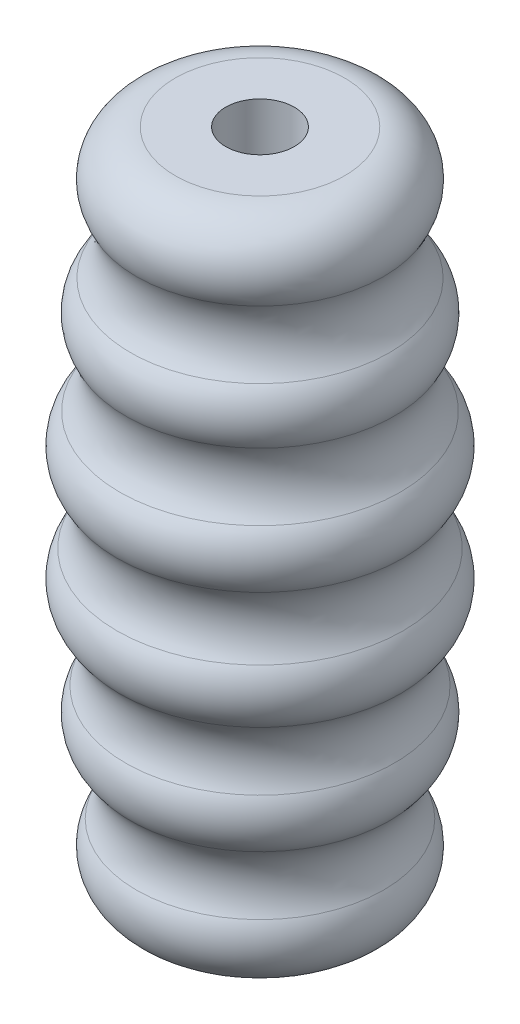
ISO-10303-21;
HEADER;
FILE_DESCRIPTION(('STEP AP214'),'2;1');
FILE_NAME('part.step','',(''),(''),'','','');
FILE_SCHEMA(('AUTOMOTIVE_DESIGN { 1 0 10303 214 1 1 1 1 }'));
ENDSEC;
DATA;
#1=APPLICATION_CONTEXT('core data for automotive mechanical design processes');
#2=APPLICATION_PROTOCOL_DEFINITION('international standard','automotive_design',2000,#1);
#3=PRODUCT_CONTEXT('',#1,'mechanical');
#4=PRODUCT('Part','Part','',(#3));
#5=PRODUCT_RELATED_PRODUCT_CATEGORY('part','',(#4));
#6=PRODUCT_DEFINITION_FORMATION('','',#4);
#7=PRODUCT_DEFINITION_CONTEXT('part definition',#1,'design');
#8=PRODUCT_DEFINITION('design','',#6,#7);
#9=PRODUCT_DEFINITION_SHAPE('','',#8);
#10=(LENGTH_UNIT() NAMED_UNIT(*) SI_UNIT(.MILLI.,.METRE.));
#11=(NAMED_UNIT(*) PLANE_ANGLE_UNIT() SI_UNIT($,.RADIAN.));
#12=(NAMED_UNIT(*) SI_UNIT($,.STERADIAN.) SOLID_ANGLE_UNIT());
#13=UNCERTAINTY_MEASURE_WITH_UNIT(LENGTH_MEASURE(1.E-05),#10,'distance_accuracy_value','');
#14=(GEOMETRIC_REPRESENTATION_CONTEXT(3) GLOBAL_UNCERTAINTY_ASSIGNED_CONTEXT((#13)) GLOBAL_UNIT_ASSIGNED_CONTEXT((#10,
#11,#12)) REPRESENTATION_CONTEXT('',''));
#15=CARTESIAN_POINT('',(0.,0.,0.));
#16=DIRECTION('',(0.,0.,1.));
#17=DIRECTION('',(1.,0.,0.));
#18=AXIS2_PLACEMENT_3D('',#15,#16,#17);
#19=CARTESIAN_POINT('',(0.,6.81659663819396,0.));
#20=DIRECTION('',(0.,1.,0.));
#21=DIRECTION('',(-1.,0.,0.));
#22=AXIS2_PLACEMENT_3D('',#19,#20,#21);
#23=TOROIDAL_SURFACE('',#22,10.0436974740688,3.);
#24=CARTESIAN_POINT('',(0.,4.84390756281543,0.));
#25=DIRECTION('',(0.,1.,0.));
#26=DIRECTION('',(-1.,0.,0.));
#27=AXIS2_PLACEMENT_3D('',#24,#25,#26);
#28=CIRCLE('',#27,7.78349885184945);
#29=CARTESIAN_POINT('',(-7.78349885184946,4.84390756281543,0.));
#30=VERTEX_POINT('',#29);
#31=EDGE_CURVE('E10',#30,#30,#28,.T.);
#32=ORIENTED_EDGE('',*,*,#31,.T.);
#33=EDGE_LOOP('',(#32));
#34=FACE_BOUND('',#33,.T.);
#35=CARTESIAN_POINT('',(0.,8.33481665372453,0.));
#36=DIRECTION('',(0.,1.,0.));
#37=DIRECTION('',(-1.,0.,0.));
#38=AXIS2_PLACEMENT_3D('',#35,#36,#37);
#39=CIRCLE('',#38,7.45622612457672);
#40=CARTESIAN_POINT('',(-7.45622612457673,8.33481665372453,0.));
#41=VERTEX_POINT('',#40);
#42=EDGE_CURVE('E78',#41,#41,#39,.T.);
#43=ORIENTED_EDGE('',*,*,#42,.F.);
#44=EDGE_LOOP('',(#43));
#45=FACE_BOUND('',#44,.T.);
#46=ADVANCED_FACE('F32',(#34,#45),#23,.F.);
#47=CARTESIAN_POINT('',(0.,3.2,0.));
#48=DIRECTION('',(0.,1.,0.));
#49=DIRECTION('',(-1.,0.,0.));
#50=AXIS2_PLACEMENT_3D('',#47,#48,#49);
#51=TOROIDAL_SURFACE('',#50,5.89999999999999,2.5);
#52=CARTESIAN_POINT('',(0.,1.74545454545455,0.));
#53=DIRECTION('',(0.,1.,0.));
#54=DIRECTION('',(-1.,0.,0.));
#55=AXIS2_PLACEMENT_3D('',#52,#53,#54);
#56=CIRCLE('',#55,7.93329720421318);
#57=CARTESIAN_POINT('',(-7.93329720421318,1.74545454545455,0.));
#58=VERTEX_POINT('',#57);
#59=EDGE_CURVE('E38',#58,#58,#56,.T.);
#60=ORIENTED_EDGE('',*,*,#59,.T.);
#61=EDGE_LOOP('',(#60));
#62=FACE_BOUND('',#61,.T.);
#63=ORIENTED_EDGE('',*,*,#31,.F.);
#64=EDGE_LOOP('',(#63));
#65=FACE_BOUND('',#64,.T.);
#66=ADVANCED_FACE('F86',(#62,#65),#51,.T.);
#67=CARTESIAN_POINT('',(0.,0.,0.));
#68=DIRECTION('',(0.,1.,0.));
#69=DIRECTION('',(-1.,0.,0.));
#70=AXIS2_PLACEMENT_3D('',#67,#68,#69);
#71=TOROIDAL_SURFACE('',#70,10.373253849269,3.);
#72=CARTESIAN_POINT('',(0.,-1.74545454545455,0.));
#73=DIRECTION('',(0.,1.,0.));
#74=DIRECTION('',(-1.,0.,0.));
#75=AXIS2_PLACEMENT_3D('',#72,#73,#74);
#76=CIRCLE('',#75,7.93329720421318);
#77=CARTESIAN_POINT('',(-7.93329720421318,-1.74545454545455,0.));
#78=VERTEX_POINT('',#77);
#79=EDGE_CURVE('E42',#78,#78,#76,.T.);
#80=ORIENTED_EDGE('',*,*,#79,.T.);
#81=EDGE_LOOP('',(#80));
#82=FACE_BOUND('',#81,.T.);
#83=ORIENTED_EDGE('',*,*,#59,.F.);
#84=EDGE_LOOP('',(#83));
#85=FACE_BOUND('',#84,.T.);
#86=ADVANCED_FACE('F90',(#82,#85),#71,.F.);
#87=CARTESIAN_POINT('',(0.,-3.2,0.));
#88=DIRECTION('',(0.,1.,0.));
#89=DIRECTION('',(-1.,0.,0.));
#90=AXIS2_PLACEMENT_3D('',#87,#88,#89);
#91=TOROIDAL_SURFACE('',#90,5.9,2.5);
#92=CARTESIAN_POINT('',(0.,-4.84390756281543,0.));
#93=DIRECTION('',(0.,1.,0.));
#94=DIRECTION('',(-1.,0.,0.));
#95=AXIS2_PLACEMENT_3D('',#92,#93,#94);
#96=CIRCLE('',#95,7.78349885184945);
#97=CARTESIAN_POINT('',(-7.78349885184946,-4.84390756281544,0.));
#98=VERTEX_POINT('',#97);
#99=EDGE_CURVE('E46',#98,#98,#96,.T.);
#100=ORIENTED_EDGE('',*,*,#99,.T.);
#101=EDGE_LOOP('',(#100));
#102=FACE_BOUND('',#101,.T.);
#103=ORIENTED_EDGE('',*,*,#79,.F.);
#104=EDGE_LOOP('',(#103));
#105=FACE_BOUND('',#104,.T.);
#106=ADVANCED_FACE('F94',(#102,#105),#91,.T.);
#107=CARTESIAN_POINT('',(0.,-6.81659663819395,0.));
#108=DIRECTION('',(0.,1.,0.));
#109=DIRECTION('',(-1.,0.,0.));
#110=AXIS2_PLACEMENT_3D('',#107,#108,#109);
#111=TOROIDAL_SURFACE('',#110,10.0436974740688,3.);
#112=CARTESIAN_POINT('',(0.,-8.33481665372452,0.));
#113=DIRECTION('',(0.,1.,0.));
#114=DIRECTION('',(-1.,0.,0.));
#115=AXIS2_PLACEMENT_3D('',#112,#113,#114);
#116=CIRCLE('',#115,7.45622612457673);
#117=CARTESIAN_POINT('',(-7.45622612457673,-8.33481665372452,0.));
#118=VERTEX_POINT('',#117);
#119=EDGE_CURVE('E51',#118,#118,#116,.T.);
#120=ORIENTED_EDGE('',*,*,#119,.T.);
#121=EDGE_LOOP('',(#120));
#122=FACE_BOUND('',#121,.T.);
#123=ORIENTED_EDGE('',*,*,#99,.F.);
#124=EDGE_LOOP('',(#123));
#125=FACE_BOUND('',#124,.T.);
#126=ADVANCED_FACE('F101',(#122,#125),#111,.F.);
#127=CARTESIAN_POINT('',(0.,-9.6,0.));
#128=DIRECTION('',(0.,1.,0.));
#129=DIRECTION('',(-1.,0.,0.));
#130=AXIS2_PLACEMENT_3D('',#127,#128,#129);
#131=TOROIDAL_SURFACE('',#130,5.29999999999999,2.5);
#132=CARTESIAN_POINT('',(0.,-11.2439075628154,0.));
#133=DIRECTION('',(0.,1.,0.));
#134=DIRECTION('',(-1.,0.,0.));
#135=AXIS2_PLACEMENT_3D('',#132,#133,#134);
#136=CIRCLE('',#135,7.18349885184945);
#137=CARTESIAN_POINT('',(-7.18349885184945,-11.2439075628154,0.));
#138=VERTEX_POINT('',#137);
#139=EDGE_CURVE('E54',#138,#138,#136,.T.);
#140=ORIENTED_EDGE('',*,*,#139,.T.);
#141=EDGE_LOOP('',(#140));
#142=FACE_BOUND('',#141,.T.);
#143=ORIENTED_EDGE('',*,*,#119,.F.);
#144=EDGE_LOOP('',(#143));
#145=FACE_BOUND('',#144,.T.);
#146=ADVANCED_FACE('F105',(#142,#145),#131,.T.);
#147=CARTESIAN_POINT('',(0.,-13.216596638194,0.));
#148=DIRECTION('',(0.,1.,0.));
#149=DIRECTION('',(-1.,0.,0.));
#150=AXIS2_PLACEMENT_3D('',#147,#148,#149);
#151=TOROIDAL_SURFACE('',#150,9.4436974740688,3.);
#152=CARTESIAN_POINT('',(0.,-14.7348166537245,0.));
#153=DIRECTION('',(0.,1.,0.));
#154=DIRECTION('',(-1.,0.,0.));
#155=AXIS2_PLACEMENT_3D('',#152,#153,#154);
#156=CIRCLE('',#155,6.85622612457672);
#157=CARTESIAN_POINT('',(-6.85622612457673,-14.7348166537245,0.));
#158=VERTEX_POINT('',#157);
#159=EDGE_CURVE('E57',#158,#158,#156,.T.);
#160=ORIENTED_EDGE('',*,*,#159,.T.);
#161=EDGE_LOOP('',(#160));
#162=FACE_BOUND('',#161,.T.);
#163=ORIENTED_EDGE('',*,*,#139,.F.);
#164=EDGE_LOOP('',(#163));
#165=FACE_BOUND('',#164,.T.);
#166=ADVANCED_FACE('F109',(#162,#165),#151,.F.);
#167=CARTESIAN_POINT('',(0.,-16.,0.));
#168=DIRECTION('',(0.,1.,0.));
#169=DIRECTION('',(-1.,0.,0.));
#170=AXIS2_PLACEMENT_3D('',#167,#168,#169);
#171=TOROIDAL_SURFACE('',#170,4.69999999999999,2.5);
#172=CARTESIAN_POINT('',(0.,-18.5,0.));
#173=DIRECTION('',(0.,1.,0.));
#174=DIRECTION('',(-1.,0.,0.));
#175=AXIS2_PLACEMENT_3D('',#172,#173,#174);
#176=CIRCLE('',#175,4.69999999999999);
#177=CARTESIAN_POINT('',(-4.7,-18.5,0.));
#178=VERTEX_POINT('',#177);
#179=EDGE_CURVE('E60',#178,#178,#176,.T.);
#180=ORIENTED_EDGE('',*,*,#179,.T.);
#181=EDGE_LOOP('',(#180));
#182=FACE_BOUND('',#181,.T.);
#183=ORIENTED_EDGE('',*,*,#159,.F.);
#184=EDGE_LOOP('',(#183));
#185=FACE_BOUND('',#184,.T.);
#186=ADVANCED_FACE('F113',(#182,#185),#171,.T.);
#187=CARTESIAN_POINT('',(-4.7,-18.5,0.));
#188=DIRECTION('',(0.,-1.,0.));
#189=DIRECTION('',(1.,0.,0.));
#190=AXIS2_PLACEMENT_3D('',#187,#188,#189);
#191=PLANE('',#190);
#192=CARTESIAN_POINT('',(0.,-18.5,0.));
#193=DIRECTION('',(0.,1.,0.));
#194=DIRECTION('',(-1.,0.,0.));
#195=AXIS2_PLACEMENT_3D('',#192,#193,#194);
#196=CIRCLE('',#195,1.9);
#197=CARTESIAN_POINT('',(-1.9,-18.5,0.));
#198=VERTEX_POINT('',#197);
#199=EDGE_CURVE('E63',#198,#198,#196,.T.);
#200=ORIENTED_EDGE('',*,*,#199,.T.);
#201=EDGE_LOOP('',(#200));
#202=FACE_BOUND('',#201,.T.);
#203=ORIENTED_EDGE('',*,*,#179,.F.);
#204=EDGE_LOOP('',(#203));
#205=FACE_BOUND('',#204,.T.);
#206=ADVANCED_FACE('F117',(#202,#205),#191,.T.);
#207=CARTESIAN_POINT('',(0.,25.8856814862195,0.));
#208=DIRECTION('',(0.,1.,0.));
#209=DIRECTION('',(-1.,0.,0.));
#210=AXIS2_PLACEMENT_3D('',#207,#208,#209);
#211=CYLINDRICAL_SURFACE('',#210,1.89999999999999);
#212=CARTESIAN_POINT('',(0.,18.5,0.));
#213=DIRECTION('',(0.,1.,0.));
#214=DIRECTION('',(-1.,0.,0.));
#215=AXIS2_PLACEMENT_3D('',#212,#213,#214);
#216=CIRCLE('',#215,1.89999999999999);
#217=CARTESIAN_POINT('',(-1.9,18.5,0.));
#218=VERTEX_POINT('',#217);
#219=EDGE_CURVE('E66',#218,#218,#216,.T.);
#220=ORIENTED_EDGE('',*,*,#219,.T.);
#221=EDGE_LOOP('',(#220));
#222=FACE_BOUND('',#221,.T.);
#223=ORIENTED_EDGE('',*,*,#199,.F.);
#224=EDGE_LOOP('',(#223));
#225=FACE_BOUND('',#224,.T.);
#226=ADVANCED_FACE('F121',(#222,#225),#211,.F.);
#227=CARTESIAN_POINT('',(-4.7,18.5,0.));
#228=DIRECTION('',(0.,1.,0.));
#229=DIRECTION('',(-1.,0.,0.));
#230=AXIS2_PLACEMENT_3D('',#227,#228,#229);
#231=PLANE('',#230);
#232=CARTESIAN_POINT('',(0.,18.5,0.));
#233=DIRECTION('',(0.,1.,0.));
#234=DIRECTION('',(-1.,0.,0.));
#235=AXIS2_PLACEMENT_3D('',#232,#233,#234);
#236=CIRCLE('',#235,4.69999999999999);
#237=CARTESIAN_POINT('',(-4.7,18.5,0.));
#238=VERTEX_POINT('',#237);
#239=EDGE_CURVE('E69',#238,#238,#236,.T.);
#240=ORIENTED_EDGE('',*,*,#239,.T.);
#241=EDGE_LOOP('',(#240));
#242=FACE_BOUND('',#241,.T.);
#243=ORIENTED_EDGE('',*,*,#219,.F.);
#244=EDGE_LOOP('',(#243));
#245=FACE_BOUND('',#244,.T.);
#246=ADVANCED_FACE('F125',(#242,#245),#231,.T.);
#247=CARTESIAN_POINT('',(0.,16.,0.));
#248=DIRECTION('',(0.,1.,0.));
#249=DIRECTION('',(-1.,0.,0.));
#250=AXIS2_PLACEMENT_3D('',#247,#248,#249);
#251=TOROIDAL_SURFACE('',#250,4.69999999999999,2.5);
#252=CARTESIAN_POINT('',(0.,14.7348166537245,0.));
#253=DIRECTION('',(0.,1.,0.));
#254=DIRECTION('',(-1.,0.,0.));
#255=AXIS2_PLACEMENT_3D('',#252,#253,#254);
#256=CIRCLE('',#255,6.85622612457672);
#257=CARTESIAN_POINT('',(-6.85622612457673,14.7348166537245,0.));
#258=VERTEX_POINT('',#257);
#259=EDGE_CURVE('E72',#258,#258,#256,.T.);
#260=ORIENTED_EDGE('',*,*,#259,.T.);
#261=EDGE_LOOP('',(#260));
#262=FACE_BOUND('',#261,.T.);
#263=ORIENTED_EDGE('',*,*,#239,.F.);
#264=EDGE_LOOP('',(#263));
#265=FACE_BOUND('',#264,.T.);
#266=ADVANCED_FACE('F129',(#262,#265),#251,.T.);
#267=CARTESIAN_POINT('',(0.,13.216596638194,0.));
#268=DIRECTION('',(0.,1.,0.));
#269=DIRECTION('',(-1.,0.,0.));
#270=AXIS2_PLACEMENT_3D('',#267,#268,#269);
#271=TOROIDAL_SURFACE('',#270,9.44369747406879,3.);
#272=CARTESIAN_POINT('',(0.,11.2439075628154,0.));
#273=DIRECTION('',(0.,1.,0.));
#274=DIRECTION('',(-1.,0.,0.));
#275=AXIS2_PLACEMENT_3D('',#272,#273,#274);
#276=CIRCLE('',#275,7.18349885184945);
#277=CARTESIAN_POINT('',(-7.18349885184946,11.2439075628154,0.));
#278=VERTEX_POINT('',#277);
#279=EDGE_CURVE('E75',#278,#278,#276,.T.);
#280=ORIENTED_EDGE('',*,*,#279,.T.);
#281=EDGE_LOOP('',(#280));
#282=FACE_BOUND('',#281,.T.);
#283=ORIENTED_EDGE('',*,*,#259,.F.);
#284=EDGE_LOOP('',(#283));
#285=FACE_BOUND('',#284,.T.);
#286=ADVANCED_FACE('F133',(#282,#285),#271,.F.);
#287=CARTESIAN_POINT('',(0.,9.6,0.));
#288=DIRECTION('',(0.,1.,0.));
#289=DIRECTION('',(-1.,0.,0.));
#290=AXIS2_PLACEMENT_3D('',#287,#288,#289);
#291=TOROIDAL_SURFACE('',#290,5.29999999999999,2.5);
#292=ORIENTED_EDGE('',*,*,#42,.T.);
#293=EDGE_LOOP('',(#292));
#294=FACE_BOUND('',#293,.T.);
#295=ORIENTED_EDGE('',*,*,#279,.F.);
#296=EDGE_LOOP('',(#295));
#297=FACE_BOUND('',#296,.T.);
#298=ADVANCED_FACE('F82',(#294,#297),#291,.T.);
#299=CLOSED_SHELL('',(#46,#66,#86,#106,#126,#146,#166,#186,#206,#226,#246,#266,#286,#298));
#300=MANIFOLD_SOLID_BREP('B2',#299);
#301=ADVANCED_BREP_SHAPE_REPRESENTATION('',(#18,#300),#14);
#302=SHAPE_DEFINITION_REPRESENTATION(#9,#301);
ENDSEC;
END-ISO-10303-21;
